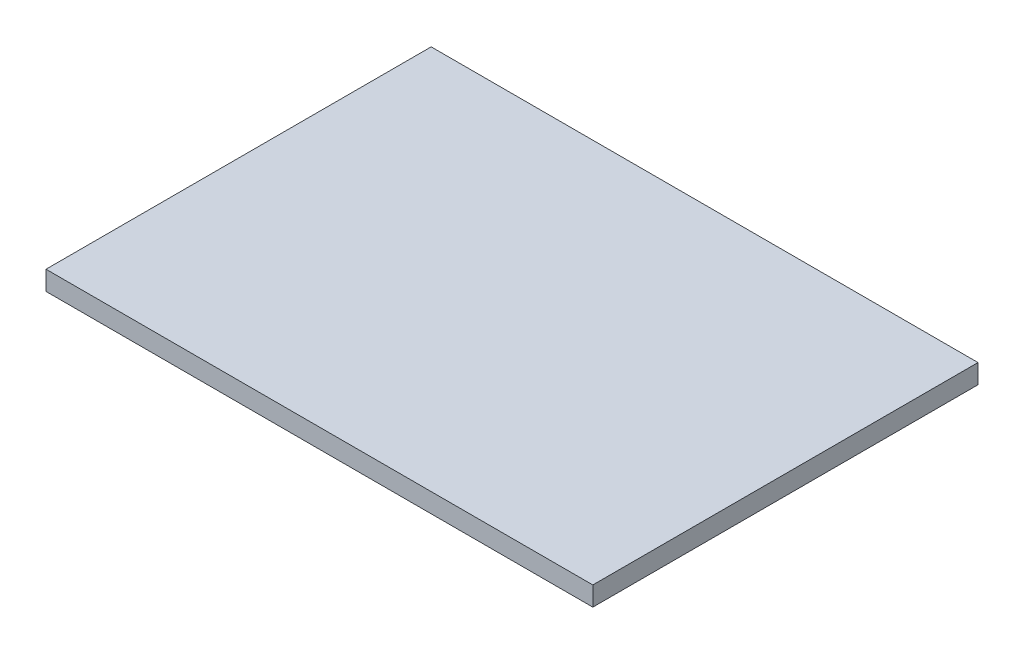
ISO-10303-21;
HEADER;
FILE_DESCRIPTION(('STEP AP214'),'2;1');
FILE_NAME('part.step','',(''),(''),'','','');
FILE_SCHEMA(('AUTOMOTIVE_DESIGN { 1 0 10303 214 1 1 1 1 }'));
ENDSEC;
DATA;
#1=APPLICATION_CONTEXT('core data for automotive mechanical design processes');
#2=APPLICATION_PROTOCOL_DEFINITION('international standard','automotive_design',2000,#1);
#3=PRODUCT_CONTEXT('',#1,'mechanical');
#4=PRODUCT('Part','Part','',(#3));
#5=PRODUCT_RELATED_PRODUCT_CATEGORY('part','',(#4));
#6=PRODUCT_DEFINITION_FORMATION('','',#4);
#7=PRODUCT_DEFINITION_CONTEXT('part definition',#1,'design');
#8=PRODUCT_DEFINITION('design','',#6,#7);
#9=PRODUCT_DEFINITION_SHAPE('','',#8);
#10=(LENGTH_UNIT() NAMED_UNIT(*) SI_UNIT(.MILLI.,.METRE.));
#11=(NAMED_UNIT(*) PLANE_ANGLE_UNIT() SI_UNIT($,.RADIAN.));
#12=(NAMED_UNIT(*) SI_UNIT($,.STERADIAN.) SOLID_ANGLE_UNIT());
#13=UNCERTAINTY_MEASURE_WITH_UNIT(LENGTH_MEASURE(1.E-05),#10,'distance_accuracy_value','');
#14=(GEOMETRIC_REPRESENTATION_CONTEXT(3) GLOBAL_UNCERTAINTY_ASSIGNED_CONTEXT((#13)) GLOBAL_UNIT_ASSIGNED_CONTEXT((#10,
#11,#12)) REPRESENTATION_CONTEXT('',''));
#15=CARTESIAN_POINT('',(0.,0.,0.));
#16=DIRECTION('',(0.,0.,1.));
#17=DIRECTION('',(1.,0.,0.));
#18=AXIS2_PLACEMENT_3D('',#15,#16,#17);
#19=CARTESIAN_POINT('',(0.,6.35,0.));
#20=DIRECTION('',(1.,0.,0.));
#21=DIRECTION('',(0.,0.,-1.));
#22=AXIS2_PLACEMENT_3D('',#19,#20,#21);
#23=PLANE('',#22);
#24=DIRECTION('',(0.,0.,1.));
#25=VECTOR('',#24,1.);
#26=CARTESIAN_POINT('',(0.,0.,0.));
#27=LINE('',#26,#25);
#28=CARTESIAN_POINT('',(0.,0.,0.));
#29=VERTEX_POINT('',#28);
#30=CARTESIAN_POINT('',(0.,0.,127.));
#31=VERTEX_POINT('',#30);
#32=EDGE_CURVE('E111',#29,#31,#27,.T.);
#33=ORIENTED_EDGE('',*,*,#32,.T.);
#34=DIRECTION('',(0.,-1.,0.));
#35=VECTOR('',#34,1.);
#36=CARTESIAN_POINT('',(0.,6.35,127.));
#37=LINE('',#36,#35);
#38=CARTESIAN_POINT('',(0.,6.35,127.));
#39=VERTEX_POINT('',#38);
#40=EDGE_CURVE('E11',#39,#31,#37,.T.);
#41=ORIENTED_EDGE('',*,*,#40,.F.);
#42=DIRECTION('',(0.,0.,1.));
#43=VECTOR('',#42,1.);
#44=CARTESIAN_POINT('',(0.,6.35,0.));
#45=LINE('',#44,#43);
#46=CARTESIAN_POINT('',(0.,6.35,0.));
#47=VERTEX_POINT('',#46);
#48=EDGE_CURVE('E95',#47,#39,#45,.T.);
#49=ORIENTED_EDGE('',*,*,#48,.F.);
#50=DIRECTION('',(0.,-1.,0.));
#51=VECTOR('',#50,1.);
#52=CARTESIAN_POINT('',(0.,6.35,0.));
#53=LINE('',#52,#51);
#54=EDGE_CURVE('E107',#47,#29,#53,.T.);
#55=ORIENTED_EDGE('',*,*,#54,.T.);
#56=EDGE_LOOP('',(#33,#41,#49,#55));
#57=FACE_BOUND('',#56,.T.);
#58=ADVANCED_FACE('F43',(#57),#23,.F.);
#59=CARTESIAN_POINT('',(0.,6.35,127.));
#60=DIRECTION('',(0.,0.,-1.));
#61=DIRECTION('',(-1.,0.,0.));
#62=AXIS2_PLACEMENT_3D('',#59,#60,#61);
#63=PLANE('',#62);
#64=DIRECTION('',(1.,0.,0.));
#65=VECTOR('',#64,1.);
#66=CARTESIAN_POINT('',(0.,0.,127.));
#67=LINE('',#66,#65);
#68=CARTESIAN_POINT('',(180.3,0.,127.));
#69=VERTEX_POINT('',#68);
#70=EDGE_CURVE('E100',#31,#69,#67,.T.);
#71=ORIENTED_EDGE('',*,*,#70,.T.);
#72=DIRECTION('',(0.,-1.,0.));
#73=VECTOR('',#72,1.);
#74=CARTESIAN_POINT('',(180.3,6.35,127.));
#75=LINE('',#74,#73);
#76=CARTESIAN_POINT('',(180.3,6.35,127.));
#77=VERTEX_POINT('',#76);
#78=EDGE_CURVE('E52',#77,#69,#75,.T.);
#79=ORIENTED_EDGE('',*,*,#78,.F.);
#80=DIRECTION('',(1.,0.,0.));
#81=VECTOR('',#80,1.);
#82=CARTESIAN_POINT('',(0.,6.35,127.));
#83=LINE('',#82,#81);
#84=EDGE_CURVE('E90',#39,#77,#83,.T.);
#85=ORIENTED_EDGE('',*,*,#84,.F.);
#86=ORIENTED_EDGE('',*,*,#40,.T.);
#87=EDGE_LOOP('',(#71,#79,#85,#86));
#88=FACE_BOUND('',#87,.T.);
#89=ADVANCED_FACE('F99',(#88),#63,.F.);
#90=CARTESIAN_POINT('',(180.3,6.35,0.));
#91=DIRECTION('',(-1.,0.,0.));
#92=DIRECTION('',(0.,0.,1.));
#93=AXIS2_PLACEMENT_3D('',#90,#91,#92);
#94=PLANE('',#93);
#95=DIRECTION('',(0.,0.,-1.));
#96=VECTOR('',#95,1.);
#97=CARTESIAN_POINT('',(180.3,0.,0.));
#98=LINE('',#97,#96);
#99=CARTESIAN_POINT('',(180.3,0.,0.));
#100=VERTEX_POINT('',#99);
#101=EDGE_CURVE('E77',#69,#100,#98,.T.);
#102=ORIENTED_EDGE('',*,*,#101,.T.);
#103=DIRECTION('',(0.,-1.,0.));
#104=VECTOR('',#103,1.);
#105=CARTESIAN_POINT('',(180.3,6.35,0.));
#106=LINE('',#105,#104);
#107=CARTESIAN_POINT('',(180.3,6.35,0.));
#108=VERTEX_POINT('',#107);
#109=EDGE_CURVE('E102',#108,#100,#106,.T.);
#110=ORIENTED_EDGE('',*,*,#109,.F.);
#111=DIRECTION('',(0.,0.,-1.));
#112=VECTOR('',#111,1.);
#113=CARTESIAN_POINT('',(180.3,6.35,0.));
#114=LINE('',#113,#112);
#115=EDGE_CURVE('E93',#77,#108,#114,.T.);
#116=ORIENTED_EDGE('',*,*,#115,.F.);
#117=ORIENTED_EDGE('',*,*,#78,.T.);
#118=EDGE_LOOP('',(#102,#110,#116,#117));
#119=FACE_BOUND('',#118,.T.);
#120=ADVANCED_FACE('F103',(#119),#94,.F.);
#121=CARTESIAN_POINT('',(0.,6.35,0.));
#122=DIRECTION('',(0.,0.,1.));
#123=DIRECTION('',(1.,0.,0.));
#124=AXIS2_PLACEMENT_3D('',#121,#122,#123);
#125=PLANE('',#124);
#126=DIRECTION('',(-1.,0.,0.));
#127=VECTOR('',#126,1.);
#128=CARTESIAN_POINT('',(0.,0.,0.));
#129=LINE('',#128,#127);
#130=EDGE_CURVE('E83',#100,#29,#129,.T.);
#131=ORIENTED_EDGE('',*,*,#130,.T.);
#132=ORIENTED_EDGE('',*,*,#54,.F.);
#133=DIRECTION('',(-1.,0.,0.));
#134=VECTOR('',#133,1.);
#135=CARTESIAN_POINT('',(0.,6.35,0.));
#136=LINE('',#135,#134);
#137=EDGE_CURVE('E60',#108,#47,#136,.T.);
#138=ORIENTED_EDGE('',*,*,#137,.F.);
#139=ORIENTED_EDGE('',*,*,#109,.T.);
#140=EDGE_LOOP('',(#131,#132,#138,#139));
#141=FACE_BOUND('',#140,.T.);
#142=ADVANCED_FACE('F124',(#141),#125,.F.);
#143=CARTESIAN_POINT('',(0.,6.35,0.));
#144=DIRECTION('',(0.,1.,0.));
#145=DIRECTION('',(0.,0.,1.));
#146=AXIS2_PLACEMENT_3D('',#143,#144,#145);
#147=PLANE('',#146);
#148=ORIENTED_EDGE('',*,*,#48,.T.);
#149=ORIENTED_EDGE('',*,*,#84,.T.);
#150=ORIENTED_EDGE('',*,*,#115,.T.);
#151=ORIENTED_EDGE('',*,*,#137,.T.);
#152=EDGE_LOOP('',(#148,#149,#150,#151));
#153=FACE_BOUND('',#152,.T.);
#154=ADVANCED_FACE('F91',(#153),#147,.T.);
#155=CARTESIAN_POINT('',(0.,0.,0.));
#156=DIRECTION('',(0.,1.,0.));
#157=DIRECTION('',(0.,0.,1.));
#158=AXIS2_PLACEMENT_3D('',#155,#156,#157);
#159=PLANE('',#158);
#160=ORIENTED_EDGE('',*,*,#32,.F.);
#161=ORIENTED_EDGE('',*,*,#130,.F.);
#162=ORIENTED_EDGE('',*,*,#101,.F.);
#163=ORIENTED_EDGE('',*,*,#70,.F.);
#164=EDGE_LOOP('',(#160,#161,#162,#163));
#165=FACE_BOUND('',#164,.T.);
#166=ADVANCED_FACE('F127',(#165),#159,.F.);
#167=CLOSED_SHELL('',(#58,#89,#120,#142,#154,#166));
#168=MANIFOLD_SOLID_BREP('B2',#167);
#169=ADVANCED_BREP_SHAPE_REPRESENTATION('',(#18,#168),#14);
#170=SHAPE_DEFINITION_REPRESENTATION(#9,#169);
ENDSEC;
END-ISO-10303-21;
